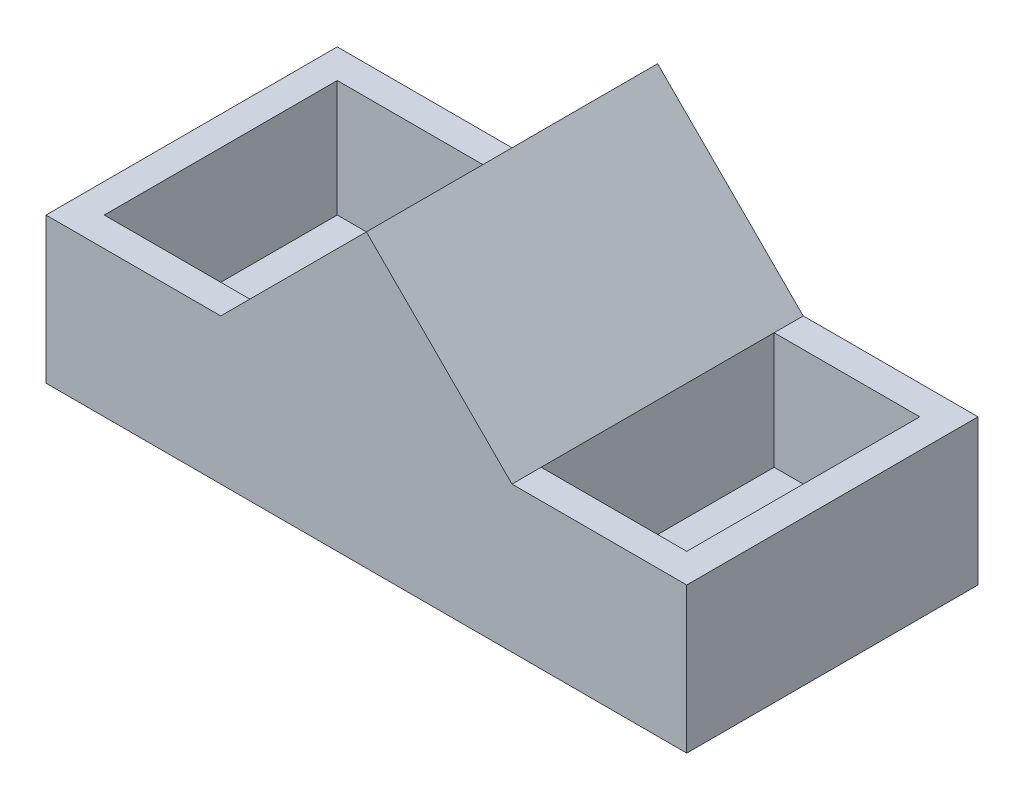
ISO-10303-21;
HEADER;
FILE_DESCRIPTION(('STEP AP214'),'2;1');
FILE_NAME('part.step','',(''),(''),'','','');
FILE_SCHEMA(('AUTOMOTIVE_DESIGN { 1 0 10303 214 1 1 1 1 }'));
ENDSEC;
DATA;
#1=APPLICATION_CONTEXT('core data for automotive mechanical design processes');
#2=APPLICATION_PROTOCOL_DEFINITION('international standard','automotive_design',2000,#1);
#3=PRODUCT_CONTEXT('',#1,'mechanical');
#4=PRODUCT('Part','Part','',(#3));
#5=PRODUCT_RELATED_PRODUCT_CATEGORY('part','',(#4));
#6=PRODUCT_DEFINITION_FORMATION('','',#4);
#7=PRODUCT_DEFINITION_CONTEXT('part definition',#1,'design');
#8=PRODUCT_DEFINITION('design','',#6,#7);
#9=PRODUCT_DEFINITION_SHAPE('','',#8);
#10=(LENGTH_UNIT() NAMED_UNIT(*) SI_UNIT(.MILLI.,.METRE.));
#11=(NAMED_UNIT(*) PLANE_ANGLE_UNIT() SI_UNIT($,.RADIAN.));
#12=(NAMED_UNIT(*) SI_UNIT($,.STERADIAN.) SOLID_ANGLE_UNIT());
#13=UNCERTAINTY_MEASURE_WITH_UNIT(LENGTH_MEASURE(1.E-05),#10,'distance_accuracy_value','');
#14=(GEOMETRIC_REPRESENTATION_CONTEXT(3) GLOBAL_UNCERTAINTY_ASSIGNED_CONTEXT((#13)) GLOBAL_UNIT_ASSIGNED_CONTEXT((#10,
#11,#12)) REPRESENTATION_CONTEXT('',''));
#15=CARTESIAN_POINT('',(0.,0.,0.));
#16=DIRECTION('',(0.,0.,1.));
#17=DIRECTION('',(1.,0.,0.));
#18=AXIS2_PLACEMENT_3D('',#15,#16,#17);
#19=CARTESIAN_POINT('',(50.,0.,100.));
#20=DIRECTION('',(-1.,0.,0.));
#21=DIRECTION('',(0.,0.,1.));
#22=AXIS2_PLACEMENT_3D('',#19,#20,#21);
#23=PLANE('',#22);
#24=DIRECTION('',(0.,1.,0.));
#25=VECTOR('',#24,1.);
#26=CARTESIAN_POINT('',(50.,9.99999999999999,90.));
#27=LINE('',#26,#25);
#28=CARTESIAN_POINT('',(50.,9.99999999999999,90.));
#29=VERTEX_POINT('',#28);
#30=CARTESIAN_POINT('',(50.,50.,90.));
#31=VERTEX_POINT('',#30);
#32=EDGE_CURVE('E62',#29,#31,#27,.T.);
#33=ORIENTED_EDGE('',*,*,#32,.F.);
#34=DIRECTION('',(0.,0.,1.));
#35=VECTOR('',#34,1.);
#36=CARTESIAN_POINT('',(50.,10.,9.99999999999999));
#37=LINE('',#36,#35);
#38=CARTESIAN_POINT('',(50.,10.,9.99999999999999));
#39=VERTEX_POINT('',#38);
#40=EDGE_CURVE('E270',#39,#29,#37,.T.);
#41=ORIENTED_EDGE('',*,*,#40,.F.);
#42=DIRECTION('',(0.,-1.,0.));
#43=VECTOR('',#42,1.);
#44=CARTESIAN_POINT('',(50.,50.,10.));
#45=LINE('',#44,#43);
#46=CARTESIAN_POINT('',(50.,50.,9.99999999999999));
#47=VERTEX_POINT('',#46);
#48=EDGE_CURVE('E266',#47,#39,#45,.T.);
#49=ORIENTED_EDGE('',*,*,#48,.F.);
#50=DIRECTION('',(0.,0.,-1.));
#51=VECTOR('',#50,1.);
#52=CARTESIAN_POINT('',(50.,50.,100.));
#53=LINE('',#52,#51);
#54=EDGE_CURVE('E159',#31,#47,#53,.T.);
#55=ORIENTED_EDGE('',*,*,#54,.F.);
#56=EDGE_LOOP('',(#33,#41,#49,#55));
#57=FACE_BOUND('',#56,.T.);
#58=ADVANCED_FACE('F39',(#57),#23,.F.);
#59=CARTESIAN_POINT('',(50.,50.,100.));
#60=DIRECTION('',(-0.707106781186547,-0.707106781186547,0.));
#61=DIRECTION('',(0.707106781186548,-0.707106781186548,0.));
#62=AXIS2_PLACEMENT_3D('',#59,#60,#61);
#63=PLANE('',#62);
#64=DIRECTION('',(-0.707106781186547,0.707106781186547,0.));
#65=VECTOR('',#64,1.);
#66=CARTESIAN_POINT('',(50.,50.,0.));
#67=LINE('',#66,#65);
#68=CARTESIAN_POINT('',(50.,50.,0.));
#69=VERTEX_POINT('',#68);
#70=CARTESIAN_POINT('',(0.,100.,0.));
#71=VERTEX_POINT('',#70);
#72=EDGE_CURVE('E298',#69,#71,#67,.T.);
#73=ORIENTED_EDGE('',*,*,#72,.T.);
#74=DIRECTION('',(0.,0.,-1.));
#75=VECTOR('',#74,1.);
#76=CARTESIAN_POINT('',(0.,100.,100.));
#77=LINE('',#76,#75);
#78=CARTESIAN_POINT('',(0.,100.,100.));
#79=VERTEX_POINT('',#78);
#80=EDGE_CURVE('E11',#79,#71,#77,.T.);
#81=ORIENTED_EDGE('',*,*,#80,.F.);
#82=DIRECTION('',(-0.707106781186547,0.707106781186547,0.));
#83=VECTOR('',#82,1.);
#84=CARTESIAN_POINT('',(50.,50.,100.));
#85=LINE('',#84,#83);
#86=CARTESIAN_POINT('',(50.,50.,100.));
#87=VERTEX_POINT('',#86);
#88=EDGE_CURVE('E299',#87,#79,#85,.T.);
#89=ORIENTED_EDGE('',*,*,#88,.F.);
#90=EDGE_CURVE('E314',#87,#31,#53,.T.);
#91=ORIENTED_EDGE('',*,*,#90,.T.);
#92=ORIENTED_EDGE('',*,*,#54,.T.);
#93=DIRECTION('',(0.,0.,1.));
#94=VECTOR('',#93,1.);
#95=CARTESIAN_POINT('',(50.,50.,0.));
#96=LINE('',#95,#94);
#97=EDGE_CURVE('E246',#69,#47,#96,.T.);
#98=ORIENTED_EDGE('',*,*,#97,.F.);
#99=EDGE_LOOP('',(#73,#81,#89,#91,#92,#98));
#100=FACE_BOUND('',#99,.T.);
#101=ADVANCED_FACE('F41',(#100),#63,.F.);
#102=CARTESIAN_POINT('',(-50.,50.,100.));
#103=DIRECTION('',(0.707106781186547,-0.707106781186547,0.));
#104=DIRECTION('',(0.707106781186548,0.707106781186548,0.));
#105=AXIS2_PLACEMENT_3D('',#102,#103,#104);
#106=PLANE('',#105);
#107=DIRECTION('',(-0.707106781186547,-0.707106781186547,0.));
#108=VECTOR('',#107,1.);
#109=CARTESIAN_POINT('',(-50.,50.,0.));
#110=LINE('',#109,#108);
#111=CARTESIAN_POINT('',(-50.,50.,0.));
#112=VERTEX_POINT('',#111);
#113=EDGE_CURVE('E308',#71,#112,#110,.T.);
#114=ORIENTED_EDGE('',*,*,#113,.T.);
#115=DIRECTION('',(0.,0.,1.));
#116=VECTOR('',#115,1.);
#117=CARTESIAN_POINT('',(-50.,50.,0.));
#118=LINE('',#117,#116);
#119=CARTESIAN_POINT('',(-50.,50.,10.));
#120=VERTEX_POINT('',#119);
#121=EDGE_CURVE('E193',#112,#120,#118,.T.);
#122=ORIENTED_EDGE('',*,*,#121,.T.);
#123=DIRECTION('',(0.,0.,-1.));
#124=VECTOR('',#123,1.);
#125=CARTESIAN_POINT('',(-50.,50.,100.));
#126=LINE('',#125,#124);
#127=CARTESIAN_POINT('',(-50.,50.,90.));
#128=VERTEX_POINT('',#127);
#129=EDGE_CURVE('E317',#128,#120,#126,.T.);
#130=ORIENTED_EDGE('',*,*,#129,.F.);
#131=CARTESIAN_POINT('',(-50.,50.,100.));
#132=VERTEX_POINT('',#131);
#133=EDGE_CURVE('E48',#132,#128,#126,.T.);
#134=ORIENTED_EDGE('',*,*,#133,.F.);
#135=DIRECTION('',(-0.707106781186547,-0.707106781186547,0.));
#136=VECTOR('',#135,1.);
#137=CARTESIAN_POINT('',(-50.,50.,100.));
#138=LINE('',#137,#136);
#139=EDGE_CURVE('E160',#79,#132,#138,.T.);
#140=ORIENTED_EDGE('',*,*,#139,.F.);
#141=ORIENTED_EDGE('',*,*,#80,.T.);
#142=EDGE_LOOP('',(#114,#122,#130,#134,#140,#141));
#143=FACE_BOUND('',#142,.T.);
#144=ADVANCED_FACE('F327',(#143),#106,.F.);
#145=CARTESIAN_POINT('',(-50.,0.,100.));
#146=DIRECTION('',(1.,0.,0.));
#147=DIRECTION('',(0.,0.,-1.));
#148=AXIS2_PLACEMENT_3D('',#145,#146,#147);
#149=PLANE('',#148);
#150=ORIENTED_EDGE('',*,*,#129,.T.);
#151=DIRECTION('',(0.,-1.,0.));
#152=VECTOR('',#151,1.);
#153=CARTESIAN_POINT('',(-50.,50.,10.));
#154=LINE('',#153,#152);
#155=CARTESIAN_POINT('',(-50.,10.,9.99999999999999));
#156=VERTEX_POINT('',#155);
#157=EDGE_CURVE('E208',#120,#156,#154,.T.);
#158=ORIENTED_EDGE('',*,*,#157,.T.);
#159=DIRECTION('',(0.,0.,1.));
#160=VECTOR('',#159,1.);
#161=CARTESIAN_POINT('',(-50.,10.,9.99999999999999));
#162=LINE('',#161,#160);
#163=CARTESIAN_POINT('',(-50.,9.99999999999999,90.));
#164=VERTEX_POINT('',#163);
#165=EDGE_CURVE('E204',#156,#164,#162,.T.);
#166=ORIENTED_EDGE('',*,*,#165,.T.);
#167=DIRECTION('',(0.,1.,0.));
#168=VECTOR('',#167,1.);
#169=CARTESIAN_POINT('',(-50.,9.99999999999999,90.));
#170=LINE('',#169,#168);
#171=EDGE_CURVE('E185',#164,#128,#170,.T.);
#172=ORIENTED_EDGE('',*,*,#171,.T.);
#173=EDGE_LOOP('',(#150,#158,#166,#172));
#174=FACE_BOUND('',#173,.T.);
#175=ADVANCED_FACE('F323',(#174),#149,.F.);
#176=CARTESIAN_POINT('',(-50.,0.,100.));
#177=DIRECTION('',(0.,1.,0.));
#178=DIRECTION('',(-1.,0.,0.));
#179=AXIS2_PLACEMENT_3D('',#176,#177,#178);
#180=PLANE('',#179);
#181=DIRECTION('',(1.,0.,0.));
#182=VECTOR('',#181,1.);
#183=CARTESIAN_POINT('',(-50.,0.,0.));
#184=LINE('',#183,#182);
#185=CARTESIAN_POINT('',(-110.,0.,0.));
#186=VERTEX_POINT('',#185);
#187=CARTESIAN_POINT('',(110.,0.,0.));
#188=VERTEX_POINT('',#187);
#189=EDGE_CURVE('E302',#186,#188,#184,.T.);
#190=ORIENTED_EDGE('',*,*,#189,.T.);
#191=DIRECTION('',(0.,0.,-1.));
#192=VECTOR('',#191,1.);
#193=CARTESIAN_POINT('',(110.,0.,0.));
#194=LINE('',#193,#192);
#195=CARTESIAN_POINT('',(110.,0.,100.));
#196=VERTEX_POINT('',#195);
#197=EDGE_CURVE('E153',#196,#188,#194,.T.);
#198=ORIENTED_EDGE('',*,*,#197,.F.);
#199=DIRECTION('',(1.,0.,0.));
#200=VECTOR('',#199,1.);
#201=CARTESIAN_POINT('',(-50.,0.,100.));
#202=LINE('',#201,#200);
#203=CARTESIAN_POINT('',(-110.,0.,100.));
#204=VERTEX_POINT('',#203);
#205=EDGE_CURVE('E147',#204,#196,#202,.T.);
#206=ORIENTED_EDGE('',*,*,#205,.F.);
#207=DIRECTION('',(0.,0.,-1.));
#208=VECTOR('',#207,1.);
#209=CARTESIAN_POINT('',(-110.,0.,0.));
#210=LINE('',#209,#208);
#211=EDGE_CURVE('E150',#204,#186,#210,.T.);
#212=ORIENTED_EDGE('',*,*,#211,.T.);
#213=EDGE_LOOP('',(#190,#198,#206,#212));
#214=FACE_BOUND('',#213,.T.);
#215=ADVANCED_FACE('F149',(#214),#180,.F.);
#216=CARTESIAN_POINT('',(0.,0.,100.));
#217=DIRECTION('',(0.,0.,-1.));
#218=DIRECTION('',(-1.,0.,0.));
#219=AXIS2_PLACEMENT_3D('',#216,#217,#218);
#220=PLANE('',#219);
#221=ORIENTED_EDGE('',*,*,#88,.T.);
#222=ORIENTED_EDGE('',*,*,#139,.T.);
#223=DIRECTION('',(1.,0.,0.));
#224=VECTOR('',#223,1.);
#225=CARTESIAN_POINT('',(-100.,50.,100.));
#226=LINE('',#225,#224);
#227=CARTESIAN_POINT('',(-110.,50.,100.));
#228=VERTEX_POINT('',#227);
#229=EDGE_CURVE('E176',#228,#132,#226,.T.);
#230=ORIENTED_EDGE('',*,*,#229,.F.);
#231=DIRECTION('',(0.,-1.,0.));
#232=VECTOR('',#231,1.);
#233=CARTESIAN_POINT('',(-110.,0.,100.));
#234=LINE('',#233,#232);
#235=EDGE_CURVE('E166',#228,#204,#234,.T.);
#236=ORIENTED_EDGE('',*,*,#235,.T.);
#237=ORIENTED_EDGE('',*,*,#205,.T.);
#238=DIRECTION('',(0.,-1.,0.));
#239=VECTOR('',#238,1.);
#240=CARTESIAN_POINT('',(110.,0.,100.));
#241=LINE('',#240,#239);
#242=CARTESIAN_POINT('',(110.,50.,100.));
#243=VERTEX_POINT('',#242);
#244=EDGE_CURVE('E243',#243,#196,#241,.T.);
#245=ORIENTED_EDGE('',*,*,#244,.F.);
#246=DIRECTION('',(-1.,0.,0.));
#247=VECTOR('',#246,1.);
#248=CARTESIAN_POINT('',(100.,50.,100.));
#249=LINE('',#248,#247);
#250=EDGE_CURVE('E294',#243,#87,#249,.T.);
#251=ORIENTED_EDGE('',*,*,#250,.T.);
#252=EDGE_LOOP('',(#221,#222,#230,#236,#237,#245,#251));
#253=FACE_BOUND('',#252,.T.);
#254=ADVANCED_FACE('F174',(#253),#220,.F.);
#255=CARTESIAN_POINT('',(0.,0.,0.));
#256=DIRECTION('',(0.,0.,-1.));
#257=DIRECTION('',(-1.,0.,0.));
#258=AXIS2_PLACEMENT_3D('',#255,#256,#257);
#259=PLANE('',#258);
#260=ORIENTED_EDGE('',*,*,#72,.F.);
#261=DIRECTION('',(-1.,0.,0.));
#262=VECTOR('',#261,1.);
#263=CARTESIAN_POINT('',(100.,50.,0.));
#264=LINE('',#263,#262);
#265=CARTESIAN_POINT('',(110.,50.,0.));
#266=VERTEX_POINT('',#265);
#267=EDGE_CURVE('E290',#266,#69,#264,.T.);
#268=ORIENTED_EDGE('',*,*,#267,.F.);
#269=DIRECTION('',(0.,1.,0.));
#270=VECTOR('',#269,1.);
#271=CARTESIAN_POINT('',(110.,50.,0.));
#272=LINE('',#271,#270);
#273=EDGE_CURVE('E235',#188,#266,#272,.T.);
#274=ORIENTED_EDGE('',*,*,#273,.F.);
#275=ORIENTED_EDGE('',*,*,#189,.F.);
#276=DIRECTION('',(0.,1.,0.));
#277=VECTOR('',#276,1.);
#278=CARTESIAN_POINT('',(-110.,50.,0.));
#279=LINE('',#278,#277);
#280=CARTESIAN_POINT('',(-110.,50.,0.));
#281=VERTEX_POINT('',#280);
#282=EDGE_CURVE('E169',#186,#281,#279,.T.);
#283=ORIENTED_EDGE('',*,*,#282,.T.);
#284=DIRECTION('',(1.,0.,0.));
#285=VECTOR('',#284,1.);
#286=CARTESIAN_POINT('',(-100.,50.,0.));
#287=LINE('',#286,#285);
#288=EDGE_CURVE('E217',#281,#112,#287,.T.);
#289=ORIENTED_EDGE('',*,*,#288,.T.);
#290=ORIENTED_EDGE('',*,*,#113,.F.);
#291=EDGE_LOOP('',(#260,#268,#274,#275,#283,#289,#290));
#292=FACE_BOUND('',#291,.T.);
#293=ADVANCED_FACE('F359',(#292),#259,.T.);
#294=CARTESIAN_POINT('',(100.,50.,90.));
#295=DIRECTION('',(0.,-1.,0.));
#296=DIRECTION('',(0.,0.,-1.));
#297=AXIS2_PLACEMENT_3D('',#294,#295,#296);
#298=PLANE('',#297);
#299=ORIENTED_EDGE('',*,*,#90,.F.);
#300=ORIENTED_EDGE('',*,*,#250,.F.);
#301=DIRECTION('',(0.,0.,1.));
#302=VECTOR('',#301,1.);
#303=CARTESIAN_POINT('',(110.,50.,100.));
#304=LINE('',#303,#302);
#305=EDGE_CURVE('E239',#266,#243,#304,.T.);
#306=ORIENTED_EDGE('',*,*,#305,.F.);
#307=ORIENTED_EDGE('',*,*,#267,.T.);
#308=ORIENTED_EDGE('',*,*,#97,.T.);
#309=DIRECTION('',(-1.,0.,0.));
#310=VECTOR('',#309,1.);
#311=CARTESIAN_POINT('',(100.,50.,10.));
#312=LINE('',#311,#310);
#313=CARTESIAN_POINT('',(100.,50.,10.));
#314=VERTEX_POINT('',#313);
#315=EDGE_CURVE('E286',#314,#47,#312,.T.);
#316=ORIENTED_EDGE('',*,*,#315,.F.);
#317=DIRECTION('',(0.,0.,1.));
#318=VECTOR('',#317,1.);
#319=CARTESIAN_POINT('',(100.,50.,100.));
#320=LINE('',#319,#318);
#321=CARTESIAN_POINT('',(100.,50.,90.));
#322=VERTEX_POINT('',#321);
#323=EDGE_CURVE('E232',#314,#322,#320,.T.);
#324=ORIENTED_EDGE('',*,*,#323,.T.);
#325=DIRECTION('',(-1.,0.,0.));
#326=VECTOR('',#325,1.);
#327=CARTESIAN_POINT('',(100.,50.,90.));
#328=LINE('',#327,#326);
#329=EDGE_CURVE('E262',#322,#31,#328,.T.);
#330=ORIENTED_EDGE('',*,*,#329,.T.);
#331=EDGE_LOOP('',(#299,#300,#306,#307,#308,#316,#324,#330));
#332=FACE_BOUND('',#331,.T.);
#333=ADVANCED_FACE('F389',(#332),#298,.F.);
#334=CARTESIAN_POINT('',(100.,50.,10.));
#335=DIRECTION('',(0.,0.,-1.));
#336=DIRECTION('',(0.,1.,0.));
#337=AXIS2_PLACEMENT_3D('',#334,#335,#336);
#338=PLANE('',#337);
#339=ORIENTED_EDGE('',*,*,#48,.T.);
#340=DIRECTION('',(-1.,0.,0.));
#341=VECTOR('',#340,1.);
#342=CARTESIAN_POINT('',(100.,10.,9.99999999999999));
#343=LINE('',#342,#341);
#344=CARTESIAN_POINT('',(100.,10.,9.99999999999999));
#345=VERTEX_POINT('',#344);
#346=EDGE_CURVE('E282',#345,#39,#343,.T.);
#347=ORIENTED_EDGE('',*,*,#346,.F.);
#348=DIRECTION('',(0.,-1.,0.));
#349=VECTOR('',#348,1.);
#350=CARTESIAN_POINT('',(100.,50.,10.));
#351=LINE('',#350,#349);
#352=EDGE_CURVE('E250',#314,#345,#351,.T.);
#353=ORIENTED_EDGE('',*,*,#352,.F.);
#354=ORIENTED_EDGE('',*,*,#315,.T.);
#355=EDGE_LOOP('',(#339,#347,#353,#354));
#356=FACE_BOUND('',#355,.T.);
#357=ADVANCED_FACE('F397',(#356),#338,.F.);
#358=CARTESIAN_POINT('',(100.,10.,9.99999999999999));
#359=DIRECTION('',(0.,-1.,0.));
#360=DIRECTION('',(0.,0.,-1.));
#361=AXIS2_PLACEMENT_3D('',#358,#359,#360);
#362=PLANE('',#361);
#363=ORIENTED_EDGE('',*,*,#40,.T.);
#364=DIRECTION('',(-1.,0.,0.));
#365=VECTOR('',#364,1.);
#366=CARTESIAN_POINT('',(100.,9.99999999999999,90.));
#367=LINE('',#366,#365);
#368=CARTESIAN_POINT('',(100.,9.99999999999999,90.));
#369=VERTEX_POINT('',#368);
#370=EDGE_CURVE('E278',#369,#29,#367,.T.);
#371=ORIENTED_EDGE('',*,*,#370,.F.);
#372=DIRECTION('',(0.,0.,1.));
#373=VECTOR('',#372,1.);
#374=CARTESIAN_POINT('',(100.,10.,9.99999999999999));
#375=LINE('',#374,#373);
#376=EDGE_CURVE('E254',#345,#369,#375,.T.);
#377=ORIENTED_EDGE('',*,*,#376,.F.);
#378=ORIENTED_EDGE('',*,*,#346,.T.);
#379=EDGE_LOOP('',(#363,#371,#377,#378));
#380=FACE_BOUND('',#379,.T.);
#381=ADVANCED_FACE('F405',(#380),#362,.F.);
#382=CARTESIAN_POINT('',(100.,9.99999999999999,90.));
#383=DIRECTION('',(0.,0.,1.));
#384=DIRECTION('',(1.,0.,0.));
#385=AXIS2_PLACEMENT_3D('',#382,#383,#384);
#386=PLANE('',#385);
#387=ORIENTED_EDGE('',*,*,#32,.T.);
#388=ORIENTED_EDGE('',*,*,#329,.F.);
#389=DIRECTION('',(0.,1.,0.));
#390=VECTOR('',#389,1.);
#391=CARTESIAN_POINT('',(100.,9.99999999999999,90.));
#392=LINE('',#391,#390);
#393=EDGE_CURVE('E258',#369,#322,#392,.T.);
#394=ORIENTED_EDGE('',*,*,#393,.F.);
#395=ORIENTED_EDGE('',*,*,#370,.T.);
#396=EDGE_LOOP('',(#387,#388,#394,#395));
#397=FACE_BOUND('',#396,.T.);
#398=ADVANCED_FACE('F413',(#397),#386,.F.);
#399=CARTESIAN_POINT('',(110.,0.,0.));
#400=DIRECTION('',(-1.,0.,0.));
#401=DIRECTION('',(0.,0.,1.));
#402=AXIS2_PLACEMENT_3D('',#399,#400,#401);
#403=PLANE('',#402);
#404=ORIENTED_EDGE('',*,*,#197,.T.);
#405=ORIENTED_EDGE('',*,*,#273,.T.);
#406=ORIENTED_EDGE('',*,*,#305,.T.);
#407=ORIENTED_EDGE('',*,*,#244,.T.);
#408=EDGE_LOOP('',(#404,#405,#406,#407));
#409=FACE_BOUND('',#408,.T.);
#410=ADVANCED_FACE('F421',(#409),#403,.F.);
#411=CARTESIAN_POINT('',(100.,0.,0.));
#412=DIRECTION('',(-1.,0.,0.));
#413=DIRECTION('',(0.,0.,1.));
#414=AXIS2_PLACEMENT_3D('',#411,#412,#413);
#415=PLANE('',#414);
#416=ORIENTED_EDGE('',*,*,#323,.F.);
#417=ORIENTED_EDGE('',*,*,#352,.T.);
#418=ORIENTED_EDGE('',*,*,#376,.T.);
#419=ORIENTED_EDGE('',*,*,#393,.T.);
#420=EDGE_LOOP('',(#416,#417,#418,#419));
#421=FACE_BOUND('',#420,.T.);
#422=ADVANCED_FACE('F429',(#421),#415,.T.);
#423=CARTESIAN_POINT('',(-100.,50.,90.));
#424=DIRECTION('',(0.,1.,0.));
#425=DIRECTION('',(0.,0.,1.));
#426=AXIS2_PLACEMENT_3D('',#423,#424,#425);
#427=PLANE('',#426);
#428=ORIENTED_EDGE('',*,*,#133,.T.);
#429=DIRECTION('',(1.,0.,0.));
#430=VECTOR('',#429,1.);
#431=CARTESIAN_POINT('',(-100.,50.,90.));
#432=LINE('',#431,#430);
#433=CARTESIAN_POINT('',(-100.,50.,90.));
#434=VERTEX_POINT('',#433);
#435=EDGE_CURVE('E229',#434,#128,#432,.T.);
#436=ORIENTED_EDGE('',*,*,#435,.F.);
#437=DIRECTION('',(0.,0.,1.));
#438=VECTOR('',#437,1.);
#439=CARTESIAN_POINT('',(-100.,50.,100.));
#440=LINE('',#439,#438);
#441=CARTESIAN_POINT('',(-100.,50.,9.99999999999999));
#442=VERTEX_POINT('',#441);
#443=EDGE_CURVE('E171',#442,#434,#440,.T.);
#444=ORIENTED_EDGE('',*,*,#443,.F.);
#445=DIRECTION('',(1.,0.,0.));
#446=VECTOR('',#445,1.);
#447=CARTESIAN_POINT('',(-100.,50.,10.));
#448=LINE('',#447,#446);
#449=EDGE_CURVE('E220',#442,#120,#448,.T.);
#450=ORIENTED_EDGE('',*,*,#449,.T.);
#451=ORIENTED_EDGE('',*,*,#121,.F.);
#452=ORIENTED_EDGE('',*,*,#288,.F.);
#453=DIRECTION('',(0.,0.,1.));
#454=VECTOR('',#453,1.);
#455=CARTESIAN_POINT('',(-110.,50.,100.));
#456=LINE('',#455,#454);
#457=EDGE_CURVE('E178',#281,#228,#456,.T.);
#458=ORIENTED_EDGE('',*,*,#457,.T.);
#459=ORIENTED_EDGE('',*,*,#229,.T.);
#460=EDGE_LOOP('',(#428,#436,#444,#450,#451,#452,#458,#459));
#461=FACE_BOUND('',#460,.T.);
#462=ADVANCED_FACE('F329',(#461),#427,.T.);
#463=CARTESIAN_POINT('',(-100.,9.99999999999999,90.));
#464=DIRECTION('',(0.,0.,-1.));
#465=DIRECTION('',(-1.,0.,0.));
#466=AXIS2_PLACEMENT_3D('',#463,#464,#465);
#467=PLANE('',#466);
#468=ORIENTED_EDGE('',*,*,#171,.F.);
#469=DIRECTION('',(1.,0.,0.));
#470=VECTOR('',#469,1.);
#471=CARTESIAN_POINT('',(-100.,9.99999999999999,90.));
#472=LINE('',#471,#470);
#473=CARTESIAN_POINT('',(-100.,9.99999999999999,90.));
#474=VERTEX_POINT('',#473);
#475=EDGE_CURVE('E226',#474,#164,#472,.T.);
#476=ORIENTED_EDGE('',*,*,#475,.F.);
#477=DIRECTION('',(0.,1.,0.));
#478=VECTOR('',#477,1.);
#479=CARTESIAN_POINT('',(-100.,9.99999999999999,90.));
#480=LINE('',#479,#478);
#481=EDGE_CURVE('E188',#474,#434,#480,.T.);
#482=ORIENTED_EDGE('',*,*,#481,.T.);
#483=ORIENTED_EDGE('',*,*,#435,.T.);
#484=EDGE_LOOP('',(#468,#476,#482,#483));
#485=FACE_BOUND('',#484,.T.);
#486=ADVANCED_FACE('F340',(#485),#467,.T.);
#487=CARTESIAN_POINT('',(-100.,10.,9.99999999999999));
#488=DIRECTION('',(0.,1.,0.));
#489=DIRECTION('',(0.,0.,1.));
#490=AXIS2_PLACEMENT_3D('',#487,#488,#489);
#491=PLANE('',#490);
#492=ORIENTED_EDGE('',*,*,#165,.F.);
#493=DIRECTION('',(1.,0.,0.));
#494=VECTOR('',#493,1.);
#495=CARTESIAN_POINT('',(-100.,10.,9.99999999999999));
#496=LINE('',#495,#494);
#497=CARTESIAN_POINT('',(-100.,10.,9.99999999999999));
#498=VERTEX_POINT('',#497);
#499=EDGE_CURVE('E223',#498,#156,#496,.T.);
#500=ORIENTED_EDGE('',*,*,#499,.F.);
#501=DIRECTION('',(0.,0.,1.));
#502=VECTOR('',#501,1.);
#503=CARTESIAN_POINT('',(-100.,10.,9.99999999999999));
#504=LINE('',#503,#502);
#505=EDGE_CURVE('E192',#498,#474,#504,.T.);
#506=ORIENTED_EDGE('',*,*,#505,.T.);
#507=ORIENTED_EDGE('',*,*,#475,.T.);
#508=EDGE_LOOP('',(#492,#500,#506,#507));
#509=FACE_BOUND('',#508,.T.);
#510=ADVANCED_FACE('F337',(#509),#491,.T.);
#511=CARTESIAN_POINT('',(-100.,50.,10.));
#512=DIRECTION('',(0.,0.,1.));
#513=DIRECTION('',(0.,-1.,0.));
#514=AXIS2_PLACEMENT_3D('',#511,#512,#513);
#515=PLANE('',#514);
#516=ORIENTED_EDGE('',*,*,#157,.F.);
#517=ORIENTED_EDGE('',*,*,#449,.F.);
#518=DIRECTION('',(0.,-1.,0.));
#519=VECTOR('',#518,1.);
#520=CARTESIAN_POINT('',(-100.,50.,10.));
#521=LINE('',#520,#519);
#522=EDGE_CURVE('E197',#442,#498,#521,.T.);
#523=ORIENTED_EDGE('',*,*,#522,.T.);
#524=ORIENTED_EDGE('',*,*,#499,.T.);
#525=EDGE_LOOP('',(#516,#517,#523,#524));
#526=FACE_BOUND('',#525,.T.);
#527=ADVANCED_FACE('F333',(#526),#515,.T.);
#528=CARTESIAN_POINT('',(-100.,0.,0.));
#529=DIRECTION('',(1.,0.,0.));
#530=DIRECTION('',(0.,0.,1.));
#531=AXIS2_PLACEMENT_3D('',#528,#529,#530);
#532=PLANE('',#531);
#533=ORIENTED_EDGE('',*,*,#481,.F.);
#534=ORIENTED_EDGE('',*,*,#505,.F.);
#535=ORIENTED_EDGE('',*,*,#522,.F.);
#536=ORIENTED_EDGE('',*,*,#443,.T.);
#537=EDGE_LOOP('',(#533,#534,#535,#536));
#538=FACE_BOUND('',#537,.T.);
#539=ADVANCED_FACE('F342',(#538),#532,.T.);
#540=CARTESIAN_POINT('',(-110.,0.,0.));
#541=DIRECTION('',(1.,0.,0.));
#542=DIRECTION('',(0.,0.,1.));
#543=AXIS2_PLACEMENT_3D('',#540,#541,#542);
#544=PLANE('',#543);
#545=ORIENTED_EDGE('',*,*,#211,.F.);
#546=ORIENTED_EDGE('',*,*,#235,.F.);
#547=ORIENTED_EDGE('',*,*,#457,.F.);
#548=ORIENTED_EDGE('',*,*,#282,.F.);
#549=EDGE_LOOP('',(#545,#546,#547,#548));
#550=FACE_BOUND('',#549,.T.);
#551=ADVANCED_FACE('F164',(#550),#544,.F.);
#552=CLOSED_SHELL('',(#58,#101,#144,#175,#215,#254,#293,#333,#357,#381,#398,#410,#422,#462,#486,
#510,#527,#539,#551));
#553=MANIFOLD_SOLID_BREP('B2',#552);
#554=ADVANCED_BREP_SHAPE_REPRESENTATION('',(#18,#553),#14);
#555=SHAPE_DEFINITION_REPRESENTATION(#9,#554);
ENDSEC;
END-ISO-10303-21;
